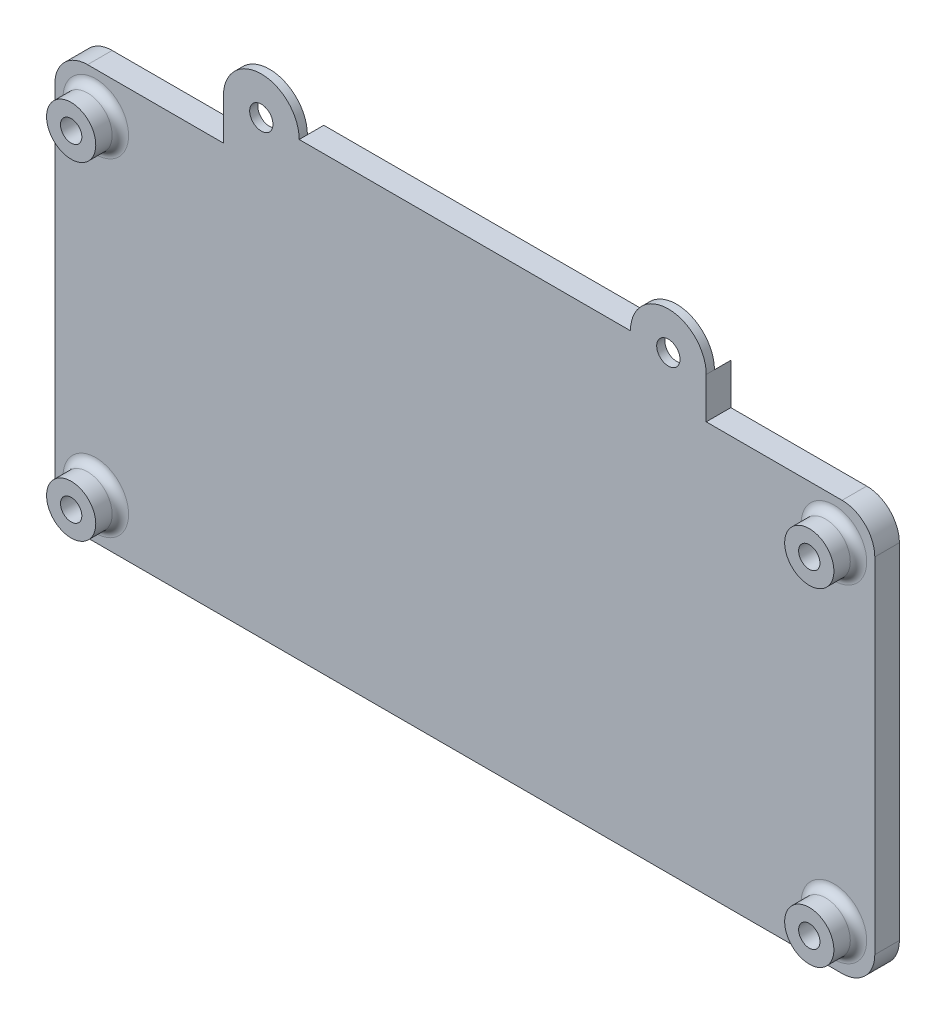
ISO-10303-21;
HEADER;
FILE_DESCRIPTION(('STEP AP214'),'2;1');
FILE_NAME('part.step','',(''),(''),'','','');
FILE_SCHEMA(('AUTOMOTIVE_DESIGN { 1 0 10303 214 1 1 1 1 }'));
ENDSEC;
DATA;
#1=APPLICATION_CONTEXT('core data for automotive mechanical design processes');
#2=APPLICATION_PROTOCOL_DEFINITION('international standard','automotive_design',2000,#1);
#3=PRODUCT_CONTEXT('',#1,'mechanical');
#4=PRODUCT('Part','Part','',(#3));
#5=PRODUCT_RELATED_PRODUCT_CATEGORY('part','',(#4));
#6=PRODUCT_DEFINITION_FORMATION('','',#4);
#7=PRODUCT_DEFINITION_CONTEXT('part definition',#1,'design');
#8=PRODUCT_DEFINITION('design','',#6,#7);
#9=PRODUCT_DEFINITION_SHAPE('','',#8);
#10=(LENGTH_UNIT() NAMED_UNIT(*) SI_UNIT(.MILLI.,.METRE.));
#11=(NAMED_UNIT(*) PLANE_ANGLE_UNIT() SI_UNIT($,.RADIAN.));
#12=(NAMED_UNIT(*) SI_UNIT($,.STERADIAN.) SOLID_ANGLE_UNIT());
#13=UNCERTAINTY_MEASURE_WITH_UNIT(LENGTH_MEASURE(1.E-05),#10,'distance_accuracy_value','');
#14=(GEOMETRIC_REPRESENTATION_CONTEXT(3) GLOBAL_UNCERTAINTY_ASSIGNED_CONTEXT((#13)) GLOBAL_UNIT_ASSIGNED_CONTEXT((#10,
#11,#12)) REPRESENTATION_CONTEXT('',''));
#15=CARTESIAN_POINT('',(0.,0.,0.));
#16=DIRECTION('',(0.,0.,1.));
#17=DIRECTION('',(1.,0.,0.));
#18=AXIS2_PLACEMENT_3D('',#15,#16,#17);
#19=CARTESIAN_POINT('',(25.1843003302005,54.987399034798,-59.6490019812324));
#20=DIRECTION('',(0.,0.,1.));
#21=DIRECTION('',(1.,0.,0.));
#22=AXIS2_PLACEMENT_3D('',#19,#20,#21);
#23=CYLINDRICAL_SURFACE('',#22,1.4224);
#24=CARTESIAN_POINT('',(25.1843003302005,54.987399034798,3.));
#25=DIRECTION('',(0.,0.,1.));
#26=DIRECTION('',(1.,0.,0.));
#27=AXIS2_PLACEMENT_3D('',#24,#25,#26);
#28=CIRCLE('',#27,1.4224);
#29=CARTESIAN_POINT('',(26.6067003302005,54.987399034798,3.));
#30=VERTEX_POINT('',#29);
#31=EDGE_CURVE('E228',#30,#30,#28,.T.);
#32=ORIENTED_EDGE('',*,*,#31,.T.);
#33=EDGE_LOOP('',(#32));
#34=FACE_BOUND('',#33,.T.);
#35=CARTESIAN_POINT('',(25.1843003302005,54.987399034798,2.));
#36=DIRECTION('',(0.,0.,-1.));
#37=DIRECTION('',(-1.,0.,0.));
#38=AXIS2_PLACEMENT_3D('',#35,#36,#37);
#39=CIRCLE('',#38,1.4224);
#40=CARTESIAN_POINT('',(23.7619003302005,54.987399034798,2.));
#41=VERTEX_POINT('',#40);
#42=EDGE_CURVE('E208',#41,#41,#39,.F.);
#43=ORIENTED_EDGE('',*,*,#42,.F.);
#44=EDGE_LOOP('',(#43));
#45=FACE_BOUND('',#44,.T.);
#46=ADVANCED_FACE('F45',(#34,#45),#23,.F.);
#47=CARTESIAN_POINT('',(74.8159003302005,54.987399034798,-59.6490019812324));
#48=DIRECTION('',(0.,0.,1.));
#49=DIRECTION('',(1.,0.,0.));
#50=AXIS2_PLACEMENT_3D('',#47,#48,#49);
#51=CYLINDRICAL_SURFACE('',#50,4.61840510398);
#52=DIRECTION('',(0.,0.,1.));
#53=VECTOR('',#52,1.);
#54=CARTESIAN_POINT('',(79.4343054346055,54.987399034798,-59.6490019812324));
#55=LINE('',#54,#53);
#56=CARTESIAN_POINT('',(79.4343054346055,54.987399034798,2.));
#57=VERTEX_POINT('',#56);
#58=CARTESIAN_POINT('',(79.4343054346055,54.987399034798,3.));
#59=VERTEX_POINT('',#58);
#60=EDGE_CURVE('E171',#57,#59,#55,.T.);
#61=ORIENTED_EDGE('',*,*,#60,.F.);
#62=CARTESIAN_POINT('',(74.8159003302005,54.987399034798,2.));
#63=DIRECTION('',(0.,0.,-1.));
#64=DIRECTION('',(-1.,0.,0.));
#65=AXIS2_PLACEMENT_3D('',#62,#63,#64);
#66=CIRCLE('',#65,4.61840510440499);
#67=CARTESIAN_POINT('',(70.1974952257955,54.987399034798,2.));
#68=VERTEX_POINT('',#67);
#69=EDGE_CURVE('E268',#68,#57,#66,.T.);
#70=ORIENTED_EDGE('',*,*,#69,.F.);
#71=DIRECTION('',(0.,0.,1.));
#72=VECTOR('',#71,1.);
#73=CARTESIAN_POINT('',(70.1974952257955,54.987399034798,-59.6490019812324));
#74=LINE('',#73,#72);
#75=CARTESIAN_POINT('',(70.1974952257955,54.987399034798,3.));
#76=VERTEX_POINT('',#75);
#77=EDGE_CURVE('E170',#68,#76,#74,.T.);
#78=ORIENTED_EDGE('',*,*,#77,.T.);
#79=CARTESIAN_POINT('',(74.8159003302005,54.987399034798,3.));
#80=DIRECTION('',(0.,0.,1.));
#81=DIRECTION('',(1.,0.,0.));
#82=AXIS2_PLACEMENT_3D('',#79,#80,#81);
#83=CIRCLE('',#82,4.61840510398);
#84=EDGE_CURVE('E216',#59,#76,#83,.T.);
#85=ORIENTED_EDGE('',*,*,#84,.F.);
#86=EDGE_LOOP('',(#61,#70,#78,#85));
#87=FACE_BOUND('',#86,.T.);
#88=ADVANCED_FACE('F457',(#87),#51,.T.);
#89=CARTESIAN_POINT('',(25.1843003302005,54.987399034798,-59.6490019812324));
#90=DIRECTION('',(0.,0.,1.));
#91=DIRECTION('',(1.,0.,0.));
#92=AXIS2_PLACEMENT_3D('',#89,#90,#91);
#93=CYLINDRICAL_SURFACE('',#92,4.61840510397999);
#94=DIRECTION('',(0.,0.,1.));
#95=VECTOR('',#94,1.);
#96=CARTESIAN_POINT('',(29.8027054346055,54.987399034798,-59.6490019812324));
#97=LINE('',#96,#95);
#98=CARTESIAN_POINT('',(29.802705434393,54.987399034798,2.));
#99=VERTEX_POINT('',#98);
#100=CARTESIAN_POINT('',(29.8027054346055,54.987399034798,3.));
#101=VERTEX_POINT('',#100);
#102=EDGE_CURVE('E240',#99,#101,#97,.T.);
#103=ORIENTED_EDGE('',*,*,#102,.F.);
#104=CARTESIAN_POINT('',(25.1843003302005,54.987399034798,2.));
#105=DIRECTION('',(0.,0.,-1.));
#106=DIRECTION('',(-1.,0.,0.));
#107=AXIS2_PLACEMENT_3D('',#104,#105,#106);
#108=CIRCLE('',#107,4.6184051041925);
#109=CARTESIAN_POINT('',(20.5660074846114,55.0195999327706,2.));
#110=VERTEX_POINT('',#109);
#111=EDGE_CURVE('E510',#110,#99,#108,.T.);
#112=ORIENTED_EDGE('',*,*,#111,.F.);
#113=DIRECTION('',(0.,0.,1.));
#114=VECTOR('',#113,1.);
#115=CARTESIAN_POINT('',(20.5660074845051,55.0195999022925,-59.6490019812324));
#116=LINE('',#115,#114);
#117=CARTESIAN_POINT('',(20.5660074845051,55.0195999022925,3.));
#118=VERTEX_POINT('',#117);
#119=EDGE_CURVE('E191',#110,#118,#116,.T.);
#120=ORIENTED_EDGE('',*,*,#119,.T.);
#121=CARTESIAN_POINT('',(25.1843003302005,54.987399034798,3.));
#122=DIRECTION('',(0.,0.,1.));
#123=DIRECTION('',(1.,0.,0.));
#124=AXIS2_PLACEMENT_3D('',#121,#122,#123);
#125=CIRCLE('',#124,4.61840510397999);
#126=EDGE_CURVE('E224',#101,#118,#125,.T.);
#127=ORIENTED_EDGE('',*,*,#126,.F.);
#128=EDGE_LOOP('',(#103,#112,#120,#127));
#129=FACE_BOUND('',#128,.T.);
#130=ADVANCED_FACE('F464',(#129),#93,.T.);
#131=CARTESIAN_POINT('',(20.3739497329237,-0.0710279611667481,-59.6490019812324));
#132=DIRECTION('',(0.999993923209248,-0.00348619342227551,0.));
#133=DIRECTION('',(0.00348619342227551,0.999993923209248,0.));
#134=AXIS2_PLACEMENT_3D('',#131,#132,#133);
#135=PLANE('',#134);
#136=DIRECTION('',(0.0034861934223459,0.999993923209247,0.));
#137=VECTOR('',#136,1.);
#138=CARTESIAN_POINT('',(20.565895226008,54.9873992176629,2.));
#139=LINE('',#138,#137);
#140=CARTESIAN_POINT('',(20.5658952256892,54.9873991262305,2.));
#141=VERTEX_POINT('',#140);
#142=EDGE_CURVE('E11',#141,#110,#139,.T.);
#143=ORIENTED_EDGE('',*,*,#142,.F.);
#144=DIRECTION('',(0.,0.,1.));
#145=VECTOR('',#144,1.);
#146=CARTESIAN_POINT('',(20.5658952253705,54.987399034798,-59.6490019812324));
#147=LINE('',#146,#145);
#148=CARTESIAN_POINT('',(20.5658952253705,54.987399034798,3.));
#149=VERTEX_POINT('',#148);
#150=EDGE_CURVE('E235',#141,#149,#147,.T.);
#151=ORIENTED_EDGE('',*,*,#150,.T.);
#152=DIRECTION('',(0.00348619342227551,0.999993923209248,0.));
#153=VECTOR('',#152,1.);
#154=CARTESIAN_POINT('',(20.3739497329237,-0.0710279611667481,3.));
#155=LINE('',#154,#153);
#156=EDGE_CURVE('E203',#149,#118,#155,.T.);
#157=ORIENTED_EDGE('',*,*,#156,.T.);
#158=ORIENTED_EDGE('',*,*,#119,.F.);
#159=EDGE_LOOP('',(#143,#151,#157,#158));
#160=FACE_BOUND('',#159,.T.);
#161=ADVANCED_FACE('F474',(#160),#135,.F.);
#162=CARTESIAN_POINT('',(74.8159003302005,54.987399034798,-59.6490019812324));
#163=DIRECTION('',(0.,0.,1.));
#164=DIRECTION('',(1.,0.,0.));
#165=AXIS2_PLACEMENT_3D('',#162,#163,#164);
#166=CYLINDRICAL_SURFACE('',#165,1.4224);
#167=CARTESIAN_POINT('',(74.8159003302005,54.987399034798,3.));
#168=DIRECTION('',(0.,0.,1.));
#169=DIRECTION('',(1.,0.,0.));
#170=AXIS2_PLACEMENT_3D('',#167,#168,#169);
#171=CIRCLE('',#170,1.4224);
#172=CARTESIAN_POINT('',(76.2383003302005,54.987399034798,3.));
#173=VERTEX_POINT('',#172);
#174=EDGE_CURVE('E232',#173,#173,#171,.T.);
#175=ORIENTED_EDGE('',*,*,#174,.T.);
#176=EDGE_LOOP('',(#175));
#177=FACE_BOUND('',#176,.T.);
#178=CARTESIAN_POINT('',(74.8159003302005,54.987399034798,2.));
#179=DIRECTION('',(0.,0.,-1.));
#180=DIRECTION('',(-1.,0.,0.));
#181=AXIS2_PLACEMENT_3D('',#178,#179,#180);
#182=CIRCLE('',#181,1.4224);
#183=CARTESIAN_POINT('',(73.3935003302005,54.987399034798,2.));
#184=VERTEX_POINT('',#183);
#185=EDGE_CURVE('E264',#184,#184,#182,.F.);
#186=ORIENTED_EDGE('',*,*,#185,.F.);
#187=EDGE_LOOP('',(#186));
#188=FACE_BOUND('',#187,.T.);
#189=ADVANCED_FACE('F470',(#177,#188),#166,.F.);
#190=CARTESIAN_POINT('',(0.,49.987399034798,3.));
#191=DIRECTION('',(0.,-1.,0.));
#192=DIRECTION('',(1.,0.,0.));
#193=AXIS2_PLACEMENT_3D('',#190,#191,#192);
#194=PLANE('',#193);
#195=DIRECTION('',(-1.,0.,0.));
#196=VECTOR('',#195,1.);
#197=CARTESIAN_POINT('',(0.,49.987399034798,3.));
#198=LINE('',#197,#196);
#199=CARTESIAN_POINT('',(20.5658952253705,49.987399034798,3.));
#200=VERTEX_POINT('',#199);
#201=CARTESIAN_POINT('',(4.00000762001499,49.987399034798,3.));
#202=VERTEX_POINT('',#201);
#203=EDGE_CURVE('E381',#200,#202,#198,.T.);
#204=ORIENTED_EDGE('',*,*,#203,.F.);
#205=DIRECTION('',(0.,0.,1.));
#206=VECTOR('',#205,1.);
#207=CARTESIAN_POINT('',(20.5658952253705,49.987399034798,-59.6490019812324));
#208=LINE('',#207,#206);
#209=CARTESIAN_POINT('',(20.5658952253705,49.987399034798,0.));
#210=VERTEX_POINT('',#209);
#211=EDGE_CURVE('E246',#210,#200,#208,.T.);
#212=ORIENTED_EDGE('',*,*,#211,.F.);
#213=DIRECTION('',(-1.,0.,0.));
#214=VECTOR('',#213,1.);
#215=CARTESIAN_POINT('',(0.,49.987399034798,0.));
#216=LINE('',#215,#214);
#217=CARTESIAN_POINT('',(4.00000762001499,49.987399034798,0.));
#218=VERTEX_POINT('',#217);
#219=EDGE_CURVE('E349',#210,#218,#216,.T.);
#220=ORIENTED_EDGE('',*,*,#219,.T.);
#221=DIRECTION('',(0.,0.,-1.));
#222=VECTOR('',#221,1.);
#223=CARTESIAN_POINT('',(4.00000762001499,49.987399034798,3.));
#224=LINE('',#223,#222);
#225=EDGE_CURVE('E309',#202,#218,#224,.T.);
#226=ORIENTED_EDGE('',*,*,#225,.F.);
#227=EDGE_LOOP('',(#204,#212,#220,#226));
#228=FACE_BOUND('',#227,.T.);
#229=ADVANCED_FACE('F491',(#228),#194,.F.);
#230=CARTESIAN_POINT('',(96.000193040386,4.00000762001503,3.));
#231=DIRECTION('',(0.,0.,-1.));
#232=DIRECTION('',(-1.,0.,0.));
#233=AXIS2_PLACEMENT_3D('',#230,#231,#232);
#234=CYLINDRICAL_SURFACE('',#233,3.98730759461498);
#235=CARTESIAN_POINT('',(96.000193040386,4.00000762001503,0.));
#236=DIRECTION('',(0.,0.,1.));
#237=DIRECTION('',(1.,0.,0.));
#238=AXIS2_PLACEMENT_3D('',#235,#236,#237);
#239=CIRCLE('',#238,3.98730759461498);
#240=CARTESIAN_POINT('',(99.987500635001,4.000007620015,0.));
#241=VERTEX_POINT('',#240);
#242=CARTESIAN_POINT('',(96.000193040386,0.01270002540005,0.));
#243=VERTEX_POINT('',#242);
#244=EDGE_CURVE('E358',#241,#243,#239,.F.);
#245=ORIENTED_EDGE('',*,*,#244,.F.);
#246=DIRECTION('',(0.,0.,-1.));
#247=VECTOR('',#246,1.);
#248=CARTESIAN_POINT('',(99.987500635001,4.000007620015,3.));
#249=LINE('',#248,#247);
#250=CARTESIAN_POINT('',(99.987500635001,4.000007620015,3.));
#251=VERTEX_POINT('',#250);
#252=EDGE_CURVE('E300',#251,#241,#249,.T.);
#253=ORIENTED_EDGE('',*,*,#252,.F.);
#254=CARTESIAN_POINT('',(96.000193040386,4.00000762001503,3.));
#255=DIRECTION('',(0.,0.,1.));
#256=DIRECTION('',(1.,0.,0.));
#257=AXIS2_PLACEMENT_3D('',#254,#255,#256);
#258=CIRCLE('',#257,3.98730759461498);
#259=CARTESIAN_POINT('',(96.000193040386,0.01270002540005,3.));
#260=VERTEX_POINT('',#259);
#261=EDGE_CURVE('E333',#251,#260,#258,.F.);
#262=ORIENTED_EDGE('',*,*,#261,.T.);
#263=DIRECTION('',(0.,0.,-1.));
#264=VECTOR('',#263,1.);
#265=CARTESIAN_POINT('',(96.000193040386,0.01270002540005,3.));
#266=LINE('',#265,#264);
#267=EDGE_CURVE('E325',#260,#243,#266,.T.);
#268=ORIENTED_EDGE('',*,*,#267,.T.);
#269=EDGE_LOOP('',(#245,#253,#262,#268));
#270=FACE_BOUND('',#269,.T.);
#271=ADVANCED_FACE('F569',(#270),#234,.T.);
#272=CARTESIAN_POINT('',(99.987500635001,0.,3.));
#273=DIRECTION('',(-1.,0.,0.));
#274=DIRECTION('',(0.,0.,1.));
#275=AXIS2_PLACEMENT_3D('',#272,#273,#274);
#276=PLANE('',#275);
#277=DIRECTION('',(0.,1.,0.));
#278=VECTOR('',#277,1.);
#279=CARTESIAN_POINT('',(99.987500635001,0.,0.));
#280=LINE('',#279,#278);
#281=CARTESIAN_POINT('',(99.987500635001,46.000091440183,0.));
#282=VERTEX_POINT('',#281);
#283=EDGE_CURVE('E354',#241,#282,#280,.T.);
#284=ORIENTED_EDGE('',*,*,#283,.T.);
#285=DIRECTION('',(0.,0.,-1.));
#286=VECTOR('',#285,1.);
#287=CARTESIAN_POINT('',(99.987500635001,46.000091440183,3.));
#288=LINE('',#287,#286);
#289=CARTESIAN_POINT('',(99.987500635001,46.000091440183,3.));
#290=VERTEX_POINT('',#289);
#291=EDGE_CURVE('E303',#290,#282,#288,.T.);
#292=ORIENTED_EDGE('',*,*,#291,.F.);
#293=DIRECTION('',(0.,1.,0.));
#294=VECTOR('',#293,1.);
#295=CARTESIAN_POINT('',(99.987500635001,0.,3.));
#296=LINE('',#295,#294);
#297=EDGE_CURVE('E386',#251,#290,#296,.T.);
#298=ORIENTED_EDGE('',*,*,#297,.F.);
#299=ORIENTED_EDGE('',*,*,#252,.T.);
#300=EDGE_LOOP('',(#284,#292,#298,#299));
#301=FACE_BOUND('',#300,.T.);
#302=ADVANCED_FACE('F572',(#301),#276,.F.);
#303=CARTESIAN_POINT('',(96.000193040386,46.000091440183,3.));
#304=DIRECTION('',(0.,0.,-1.));
#305=DIRECTION('',(-1.,0.,0.));
#306=AXIS2_PLACEMENT_3D('',#303,#304,#305);
#307=CYLINDRICAL_SURFACE('',#306,3.987307594615);
#308=CARTESIAN_POINT('',(96.000193040386,46.000091440183,0.));
#309=DIRECTION('',(0.,0.,1.));
#310=DIRECTION('',(1.,0.,0.));
#311=AXIS2_PLACEMENT_3D('',#308,#309,#310);
#312=CIRCLE('',#311,3.987307594615);
#313=CARTESIAN_POINT('',(96.000193040386,49.987399034798,0.));
#314=VERTEX_POINT('',#313);
#315=EDGE_CURVE('E350',#314,#282,#312,.F.);
#316=ORIENTED_EDGE('',*,*,#315,.F.);
#317=DIRECTION('',(0.,0.,-1.));
#318=VECTOR('',#317,1.);
#319=CARTESIAN_POINT('',(96.000193040386,49.987399034798,3.));
#320=LINE('',#319,#318);
#321=CARTESIAN_POINT('',(96.000193040386,49.987399034798,3.));
#322=VERTEX_POINT('',#321);
#323=EDGE_CURVE('E306',#322,#314,#320,.T.);
#324=ORIENTED_EDGE('',*,*,#323,.F.);
#325=CARTESIAN_POINT('',(96.000193040386,46.000091440183,3.));
#326=DIRECTION('',(0.,0.,1.));
#327=DIRECTION('',(1.,0.,0.));
#328=AXIS2_PLACEMENT_3D('',#325,#326,#327);
#329=CIRCLE('',#328,3.987307594615);
#330=EDGE_CURVE('E382',#322,#290,#329,.F.);
#331=ORIENTED_EDGE('',*,*,#330,.T.);
#332=ORIENTED_EDGE('',*,*,#291,.T.);
#333=EDGE_LOOP('',(#316,#324,#331,#332));
#334=FACE_BOUND('',#333,.T.);
#335=ADVANCED_FACE('F575',(#334),#307,.T.);
#336=CARTESIAN_POINT('',(79.4343054350305,49.987399034798,0.));
#337=VERTEX_POINT('',#336);
#338=EDGE_CURVE('E346',#314,#337,#216,.T.);
#339=ORIENTED_EDGE('',*,*,#338,.T.);
#340=DIRECTION('',(0.,0.,1.));
#341=VECTOR('',#340,1.);
#342=CARTESIAN_POINT('',(79.4343054350305,49.987399034798,-59.6490019812324));
#343=LINE('',#342,#341);
#344=CARTESIAN_POINT('',(79.4343054350305,49.987399034798,3.));
#345=VERTEX_POINT('',#344);
#346=EDGE_CURVE('E189',#337,#345,#343,.T.);
#347=ORIENTED_EDGE('',*,*,#346,.T.);
#348=EDGE_CURVE('E377',#322,#345,#198,.T.);
#349=ORIENTED_EDGE('',*,*,#348,.F.);
#350=ORIENTED_EDGE('',*,*,#323,.T.);
#351=EDGE_LOOP('',(#339,#347,#349,#350));
#352=FACE_BOUND('',#351,.T.);
#353=ADVANCED_FACE('F578',(#352),#194,.F.);
#354=CARTESIAN_POINT('',(4.00000762001498,46.000091440183,3.));
#355=DIRECTION('',(0.,0.,-1.));
#356=DIRECTION('',(-1.,0.,0.));
#357=AXIS2_PLACEMENT_3D('',#354,#355,#356);
#358=CYLINDRICAL_SURFACE('',#357,3.98730759461493);
#359=CARTESIAN_POINT('',(4.00000762001498,46.000091440183,0.));
#360=DIRECTION('',(0.,0.,1.));
#361=DIRECTION('',(1.,0.,0.));
#362=AXIS2_PLACEMENT_3D('',#359,#360,#361);
#363=CIRCLE('',#362,3.98730759461493);
#364=CARTESIAN_POINT('',(0.01270002540005,46.000091440183,0.));
#365=VERTEX_POINT('',#364);
#366=EDGE_CURVE('E342',#218,#365,#363,.T.);
#367=ORIENTED_EDGE('',*,*,#366,.T.);
#368=DIRECTION('',(0.,0.,-1.));
#369=VECTOR('',#368,1.);
#370=CARTESIAN_POINT('',(0.01270002540005,46.000091440183,3.));
#371=LINE('',#370,#369);
#372=CARTESIAN_POINT('',(0.01270002540005,46.000091440183,3.));
#373=VERTEX_POINT('',#372);
#374=EDGE_CURVE('E313',#373,#365,#371,.T.);
#375=ORIENTED_EDGE('',*,*,#374,.F.);
#376=CARTESIAN_POINT('',(4.00000762001498,46.000091440183,3.));
#377=DIRECTION('',(0.,0.,1.));
#378=DIRECTION('',(1.,0.,0.));
#379=AXIS2_PLACEMENT_3D('',#376,#377,#378);
#380=CIRCLE('',#379,3.98730759461493);
#381=EDGE_CURVE('E373',#202,#373,#380,.T.);
#382=ORIENTED_EDGE('',*,*,#381,.F.);
#383=ORIENTED_EDGE('',*,*,#225,.T.);
#384=EDGE_LOOP('',(#367,#375,#382,#383));
#385=FACE_BOUND('',#384,.T.);
#386=ADVANCED_FACE('F553',(#385),#358,.T.);
#387=CARTESIAN_POINT('',(0.0127000254000502,0.,3.));
#388=DIRECTION('',(1.,0.,0.));
#389=DIRECTION('',(0.,1.,0.));
#390=AXIS2_PLACEMENT_3D('',#387,#388,#389);
#391=PLANE('',#390);
#392=DIRECTION('',(0.,-1.,0.));
#393=VECTOR('',#392,1.);
#394=CARTESIAN_POINT('',(0.0127000254000502,0.,0.));
#395=LINE('',#394,#393);
#396=CARTESIAN_POINT('',(0.0127000254000502,4.00000762001497,0.));
#397=VERTEX_POINT('',#396);
#398=EDGE_CURVE('E338',#365,#397,#395,.T.);
#399=ORIENTED_EDGE('',*,*,#398,.T.);
#400=DIRECTION('',(0.,0.,-1.));
#401=VECTOR('',#400,1.);
#402=CARTESIAN_POINT('',(0.0127000254000502,4.00000762001497,3.));
#403=LINE('',#402,#401);
#404=CARTESIAN_POINT('',(0.0127000254000502,4.00000762001497,3.));
#405=VERTEX_POINT('',#404);
#406=EDGE_CURVE('E317',#405,#397,#403,.T.);
#407=ORIENTED_EDGE('',*,*,#406,.F.);
#408=DIRECTION('',(0.,-1.,0.));
#409=VECTOR('',#408,1.);
#410=CARTESIAN_POINT('',(0.0127000254000502,0.,3.));
#411=LINE('',#410,#409);
#412=EDGE_CURVE('E369',#373,#405,#411,.T.);
#413=ORIENTED_EDGE('',*,*,#412,.F.);
#414=ORIENTED_EDGE('',*,*,#374,.T.);
#415=EDGE_LOOP('',(#399,#407,#413,#414));
#416=FACE_BOUND('',#415,.T.);
#417=ADVANCED_FACE('F558',(#416),#391,.F.);
#418=CARTESIAN_POINT('',(4.00000762001501,4.00000762001501,3.));
#419=DIRECTION('',(0.,0.,-1.));
#420=DIRECTION('',(-1.,0.,0.));
#421=AXIS2_PLACEMENT_3D('',#418,#419,#420);
#422=CYLINDRICAL_SURFACE('',#421,3.98730759461496);
#423=CARTESIAN_POINT('',(4.00000762001501,4.00000762001501,0.));
#424=DIRECTION('',(0.,0.,1.));
#425=DIRECTION('',(1.,0.,0.));
#426=AXIS2_PLACEMENT_3D('',#423,#424,#425);
#427=CIRCLE('',#426,3.98730759461496);
#428=CARTESIAN_POINT('',(4.000007620015,0.01270002540005,0.));
#429=VERTEX_POINT('',#428);
#430=EDGE_CURVE('E334',#397,#429,#427,.T.);
#431=ORIENTED_EDGE('',*,*,#430,.T.);
#432=DIRECTION('',(0.,0.,-1.));
#433=VECTOR('',#432,1.);
#434=CARTESIAN_POINT('',(4.000007620015,0.01270002540005,3.));
#435=LINE('',#434,#433);
#436=CARTESIAN_POINT('',(4.000007620015,0.01270002540005,3.));
#437=VERTEX_POINT('',#436);
#438=EDGE_CURVE('E321',#437,#429,#435,.T.);
#439=ORIENTED_EDGE('',*,*,#438,.F.);
#440=CARTESIAN_POINT('',(4.00000762001501,4.00000762001501,3.));
#441=DIRECTION('',(0.,0.,1.));
#442=DIRECTION('',(1.,0.,0.));
#443=AXIS2_PLACEMENT_3D('',#440,#441,#442);
#444=CIRCLE('',#443,3.98730759461496);
#445=EDGE_CURVE('E365',#405,#437,#444,.T.);
#446=ORIENTED_EDGE('',*,*,#445,.F.);
#447=ORIENTED_EDGE('',*,*,#406,.T.);
#448=EDGE_LOOP('',(#431,#439,#446,#447));
#449=FACE_BOUND('',#448,.T.);
#450=ADVANCED_FACE('F560',(#449),#422,.T.);
#451=CARTESIAN_POINT('',(0.,0.01270002540005,3.));
#452=DIRECTION('',(0.,1.,0.));
#453=DIRECTION('',(0.,0.,1.));
#454=AXIS2_PLACEMENT_3D('',#451,#452,#453);
#455=PLANE('',#454);
#456=DIRECTION('',(1.,0.,0.));
#457=VECTOR('',#456,1.);
#458=CARTESIAN_POINT('',(0.,0.01270002540005,0.));
#459=LINE('',#458,#457);
#460=EDGE_CURVE('E329',#429,#243,#459,.T.);
#461=ORIENTED_EDGE('',*,*,#460,.T.);
#462=ORIENTED_EDGE('',*,*,#267,.F.);
#463=DIRECTION('',(1.,0.,0.));
#464=VECTOR('',#463,1.);
#465=CARTESIAN_POINT('',(0.,0.01270002540005,3.));
#466=LINE('',#465,#464);
#467=EDGE_CURVE('E328',#437,#260,#466,.T.);
#468=ORIENTED_EDGE('',*,*,#467,.F.);
#469=ORIENTED_EDGE('',*,*,#438,.T.);
#470=EDGE_LOOP('',(#461,#462,#468,#469));
#471=FACE_BOUND('',#470,.T.);
#472=ADVANCED_FACE('F562',(#471),#455,.F.);
#473=CARTESIAN_POINT('',(0.,0.,3.));
#474=DIRECTION('',(0.,0.,1.));
#475=DIRECTION('',(1.,0.,0.));
#476=AXIS2_PLACEMENT_3D('',#473,#474,#475);
#477=PLANE('',#476);
#478=CARTESIAN_POINT('',(95.000190500381,5.00001016002,3.));
#479=DIRECTION('',(0.,0.,1.));
#480=DIRECTION('',(1.,0.,0.));
#481=AXIS2_PLACEMENT_3D('',#478,#479,#480);
#482=CIRCLE('',#481,4.00000000000001);
#483=CARTESIAN_POINT('',(99.000190500381,5.00001016002,3.));
#484=VERTEX_POINT('',#483);
#485=EDGE_CURVE('E280',#484,#484,#482,.F.);
#486=ORIENTED_EDGE('',*,*,#485,.T.);
#487=EDGE_LOOP('',(#486));
#488=FACE_BOUND('',#487,.T.);
#489=CARTESIAN_POINT('',(95.000190500381,45.000088900178,3.));
#490=DIRECTION('',(0.,0.,1.));
#491=DIRECTION('',(1.,0.,0.));
#492=AXIS2_PLACEMENT_3D('',#489,#490,#491);
#493=CIRCLE('',#492,4.00000000000001);
#494=CARTESIAN_POINT('',(99.000190500381,45.000088900178,3.));
#495=VERTEX_POINT('',#494);
#496=EDGE_CURVE('E284',#495,#495,#493,.F.);
#497=ORIENTED_EDGE('',*,*,#496,.T.);
#498=EDGE_LOOP('',(#497));
#499=FACE_BOUND('',#498,.T.);
#500=CARTESIAN_POINT('',(5.00001016002,45.000088900178,3.));
#501=DIRECTION('',(0.,0.,1.));
#502=DIRECTION('',(1.,0.,0.));
#503=AXIS2_PLACEMENT_3D('',#500,#501,#502);
#504=CIRCLE('',#503,4.);
#505=CARTESIAN_POINT('',(9.00001016002,45.000088900178,3.));
#506=VERTEX_POINT('',#505);
#507=EDGE_CURVE('E288',#506,#506,#504,.F.);
#508=ORIENTED_EDGE('',*,*,#507,.T.);
#509=EDGE_LOOP('',(#508));
#510=FACE_BOUND('',#509,.T.);
#511=CARTESIAN_POINT('',(5.00001016002,5.00001016002,3.));
#512=DIRECTION('',(0.,0.,1.));
#513=DIRECTION('',(1.,0.,0.));
#514=AXIS2_PLACEMENT_3D('',#511,#512,#513);
#515=CIRCLE('',#514,4.);
#516=CARTESIAN_POINT('',(9.00001016002,5.00001016002,3.));
#517=VERTEX_POINT('',#516);
#518=EDGE_CURVE('E292',#517,#517,#515,.F.);
#519=ORIENTED_EDGE('',*,*,#518,.T.);
#520=EDGE_LOOP('',(#519));
#521=FACE_BOUND('',#520,.T.);
#522=ORIENTED_EDGE('',*,*,#261,.F.);
#523=ORIENTED_EDGE('',*,*,#297,.T.);
#524=ORIENTED_EDGE('',*,*,#330,.F.);
#525=ORIENTED_EDGE('',*,*,#348,.T.);
#526=DIRECTION('',(0.,1.,0.));
#527=VECTOR('',#526,1.);
#528=CARTESIAN_POINT('',(79.4343054350305,0.,3.));
#529=LINE('',#528,#527);
#530=EDGE_CURVE('E212',#345,#59,#529,.T.);
#531=ORIENTED_EDGE('',*,*,#530,.T.);
#532=ORIENTED_EDGE('',*,*,#84,.T.);
#533=DIRECTION('',(1.,0.,0.));
#534=VECTOR('',#533,1.);
#535=CARTESIAN_POINT('',(0.,54.987399034798,3.));
#536=LINE('',#535,#534);
#537=EDGE_CURVE('E220',#101,#76,#536,.T.);
#538=ORIENTED_EDGE('',*,*,#537,.F.);
#539=ORIENTED_EDGE('',*,*,#126,.T.);
#540=ORIENTED_EDGE('',*,*,#156,.F.);
#541=DIRECTION('',(0.,-1.,0.));
#542=VECTOR('',#541,1.);
#543=CARTESIAN_POINT('',(20.5658952253707,0.,3.));
#544=LINE('',#543,#542);
#545=EDGE_CURVE('E207',#149,#200,#544,.T.);
#546=ORIENTED_EDGE('',*,*,#545,.T.);
#547=ORIENTED_EDGE('',*,*,#203,.T.);
#548=ORIENTED_EDGE('',*,*,#381,.T.);
#549=ORIENTED_EDGE('',*,*,#412,.T.);
#550=ORIENTED_EDGE('',*,*,#445,.T.);
#551=ORIENTED_EDGE('',*,*,#467,.T.);
#552=EDGE_LOOP('',(#522,#523,#524,#525,#531,#532,#538,#539,#540,#546,#547,#548,#549,#550,#551));
#553=FACE_BOUND('',#552,.T.);
#554=ORIENTED_EDGE('',*,*,#31,.F.);
#555=EDGE_LOOP('',(#554));
#556=FACE_BOUND('',#555,.T.);
#557=ORIENTED_EDGE('',*,*,#174,.F.);
#558=EDGE_LOOP('',(#557));
#559=FACE_BOUND('',#558,.T.);
#560=ADVANCED_FACE('F504',(#488,#499,#510,#521,#553,#556,#559),#477,.T.);
#561=CARTESIAN_POINT('',(0.,0.,0.));
#562=DIRECTION('',(0.,0.,1.));
#563=DIRECTION('',(1.,0.,0.));
#564=AXIS2_PLACEMENT_3D('',#561,#562,#563);
#565=PLANE('',#564);
#566=DIRECTION('',(-1.,0.,0.));
#567=VECTOR('',#566,1.);
#568=CARTESIAN_POINT('',(0.,54.987399034798,0.));
#569=LINE('',#568,#567);
#570=CARTESIAN_POINT('',(70.1974952262205,54.987399034798,0.));
#571=VERTEX_POINT('',#570);
#572=CARTESIAN_POINT('',(29.802705434393,54.987399034798,0.));
#573=VERTEX_POINT('',#572);
#574=EDGE_CURVE('E182',#571,#573,#569,.T.);
#575=ORIENTED_EDGE('',*,*,#574,.F.);
#576=CARTESIAN_POINT('',(74.8159003302005,54.987399034798,0.));
#577=DIRECTION('',(0.,0.,-1.));
#578=DIRECTION('',(-1.,0.,0.));
#579=AXIS2_PLACEMENT_3D('',#576,#577,#578);
#580=CIRCLE('',#579,4.61840510440499);
#581=CARTESIAN_POINT('',(79.4343054346055,54.987399034798,0.));
#582=VERTEX_POINT('',#581);
#583=EDGE_CURVE('E162',#582,#571,#580,.T.);
#584=ORIENTED_EDGE('',*,*,#583,.F.);
#585=DIRECTION('',(0.,-1.,0.));
#586=VECTOR('',#585,1.);
#587=CARTESIAN_POINT('',(79.4343054350305,0.,0.));
#588=LINE('',#587,#586);
#589=EDGE_CURVE('E178',#582,#337,#588,.T.);
#590=ORIENTED_EDGE('',*,*,#589,.T.);
#591=ORIENTED_EDGE('',*,*,#338,.F.);
#592=ORIENTED_EDGE('',*,*,#315,.T.);
#593=ORIENTED_EDGE('',*,*,#283,.F.);
#594=ORIENTED_EDGE('',*,*,#244,.T.);
#595=ORIENTED_EDGE('',*,*,#460,.F.);
#596=ORIENTED_EDGE('',*,*,#430,.F.);
#597=ORIENTED_EDGE('',*,*,#398,.F.);
#598=ORIENTED_EDGE('',*,*,#366,.F.);
#599=ORIENTED_EDGE('',*,*,#219,.F.);
#600=DIRECTION('',(0.,1.,0.));
#601=VECTOR('',#600,1.);
#602=CARTESIAN_POINT('',(20.5658952253707,0.,0.));
#603=LINE('',#602,#601);
#604=CARTESIAN_POINT('',(20.565895226008,54.9873992176629,0.));
#605=VERTEX_POINT('',#604);
#606=EDGE_CURVE('E195',#210,#605,#603,.T.);
#607=ORIENTED_EDGE('',*,*,#606,.T.);
#608=CARTESIAN_POINT('',(25.1843003302005,54.987399034798,0.));
#609=DIRECTION('',(0.,0.,-1.));
#610=DIRECTION('',(-1.,0.,0.));
#611=AXIS2_PLACEMENT_3D('',#608,#609,#610);
#612=CIRCLE('',#611,4.6184051041925);
#613=EDGE_CURVE('E185',#573,#605,#612,.T.);
#614=ORIENTED_EDGE('',*,*,#613,.F.);
#615=EDGE_LOOP('',(#575,#584,#590,#591,#592,#593,#594,#595,#596,#597,#598,#599,#607,#614));
#616=FACE_BOUND('',#615,.T.);
#617=CARTESIAN_POINT('',(5.00001016002,45.000088900178,0.));
#618=DIRECTION('',(0.,0.,1.));
#619=DIRECTION('',(1.,0.,0.));
#620=AXIS2_PLACEMENT_3D('',#617,#618,#619);
#621=CIRCLE('',#620,1.3);
#622=CARTESIAN_POINT('',(6.30001016002,45.000088900178,0.));
#623=VERTEX_POINT('',#622);
#624=EDGE_CURVE('E392',#623,#623,#621,.T.);
#625=ORIENTED_EDGE('',*,*,#624,.T.);
#626=EDGE_LOOP('',(#625));
#627=FACE_BOUND('',#626,.T.);
#628=CARTESIAN_POINT('',(95.000190500381,45.000088900178,0.));
#629=DIRECTION('',(0.,0.,1.));
#630=DIRECTION('',(1.,0.,0.));
#631=AXIS2_PLACEMENT_3D('',#628,#629,#630);
#632=CIRCLE('',#631,1.29999999999999);
#633=CARTESIAN_POINT('',(96.300190500381,45.000088900178,0.));
#634=VERTEX_POINT('',#633);
#635=EDGE_CURVE('E404',#634,#634,#632,.T.);
#636=ORIENTED_EDGE('',*,*,#635,.T.);
#637=EDGE_LOOP('',(#636));
#638=FACE_BOUND('',#637,.T.);
#639=CARTESIAN_POINT('',(95.000190500381,5.00001016002,0.));
#640=DIRECTION('',(0.,0.,1.));
#641=DIRECTION('',(1.,0.,0.));
#642=AXIS2_PLACEMENT_3D('',#639,#640,#641);
#643=CIRCLE('',#642,1.29999999999999);
#644=CARTESIAN_POINT('',(96.300190500381,5.00001016002,0.));
#645=VERTEX_POINT('',#644);
#646=EDGE_CURVE('E416',#645,#645,#643,.T.);
#647=ORIENTED_EDGE('',*,*,#646,.T.);
#648=EDGE_LOOP('',(#647));
#649=FACE_BOUND('',#648,.T.);
#650=CARTESIAN_POINT('',(5.00001016002,5.00001016002,0.));
#651=DIRECTION('',(0.,0.,1.));
#652=DIRECTION('',(1.,0.,0.));
#653=AXIS2_PLACEMENT_3D('',#650,#651,#652);
#654=CIRCLE('',#653,1.3);
#655=CARTESIAN_POINT('',(6.30001016002,5.00001016002,0.));
#656=VERTEX_POINT('',#655);
#657=EDGE_CURVE('E263',#656,#656,#654,.T.);
#658=ORIENTED_EDGE('',*,*,#657,.T.);
#659=EDGE_LOOP('',(#658));
#660=FACE_BOUND('',#659,.T.);
#661=ADVANCED_FACE('F175',(#616,#627,#638,#649,#660),#565,.F.);
#662=CARTESIAN_POINT('',(5.00001016002,45.000088900178,6.));
#663=DIRECTION('',(0.,0.,-1.));
#664=DIRECTION('',(-1.,0.,0.));
#665=AXIS2_PLACEMENT_3D('',#662,#663,#664);
#666=CYLINDRICAL_SURFACE('',#665,1.3);
#667=CARTESIAN_POINT('',(5.00001016002,45.000088900178,6.));
#668=DIRECTION('',(0.,0.,1.));
#669=DIRECTION('',(1.,0.,0.));
#670=AXIS2_PLACEMENT_3D('',#667,#668,#669);
#671=CIRCLE('',#670,1.3);
#672=CARTESIAN_POINT('',(6.30001016002,45.000088900178,6.));
#673=VERTEX_POINT('',#672);
#674=EDGE_CURVE('E396',#673,#673,#671,.T.);
#675=ORIENTED_EDGE('',*,*,#674,.T.);
#676=EDGE_LOOP('',(#675));
#677=FACE_BOUND('',#676,.T.);
#678=ORIENTED_EDGE('',*,*,#624,.F.);
#679=EDGE_LOOP('',(#678));
#680=FACE_BOUND('',#679,.T.);
#681=ADVANCED_FACE('F616',(#677,#680),#666,.F.);
#682=CARTESIAN_POINT('',(5.00001016002,45.000088900178,6.));
#683=DIRECTION('',(0.,0.,-1.));
#684=DIRECTION('',(-1.,0.,0.));
#685=AXIS2_PLACEMENT_3D('',#682,#683,#684);
#686=CYLINDRICAL_SURFACE('',#685,3.);
#687=CARTESIAN_POINT('',(5.00001016002,45.000088900178,4.));
#688=DIRECTION('',(0.,0.,1.));
#689=DIRECTION('',(1.,0.,0.));
#690=AXIS2_PLACEMENT_3D('',#687,#688,#689);
#691=CIRCLE('',#690,3.);
#692=CARTESIAN_POINT('',(8.00001016002,45.000088900178,4.));
#693=VERTEX_POINT('',#692);
#694=EDGE_CURVE('E272',#693,#693,#691,.T.);
#695=ORIENTED_EDGE('',*,*,#694,.T.);
#696=EDGE_LOOP('',(#695));
#697=FACE_BOUND('',#696,.T.);
#698=CARTESIAN_POINT('',(5.00001016002,45.000088900178,6.));
#699=DIRECTION('',(0.,0.,1.));
#700=DIRECTION('',(1.,0.,0.));
#701=AXIS2_PLACEMENT_3D('',#698,#699,#700);
#702=CIRCLE('',#701,3.);
#703=CARTESIAN_POINT('',(8.00001016002,45.000088900178,6.));
#704=VERTEX_POINT('',#703);
#705=EDGE_CURVE('E362',#704,#704,#702,.T.);
#706=ORIENTED_EDGE('',*,*,#705,.F.);
#707=EDGE_LOOP('',(#706));
#708=FACE_BOUND('',#707,.T.);
#709=ADVANCED_FACE('F612',(#697,#708),#686,.T.);
#710=CARTESIAN_POINT('',(0.,0.,6.));
#711=DIRECTION('',(0.,0.,1.));
#712=DIRECTION('',(1.,0.,0.));
#713=AXIS2_PLACEMENT_3D('',#710,#711,#712);
#714=PLANE('',#713);
#715=ORIENTED_EDGE('',*,*,#674,.F.);
#716=EDGE_LOOP('',(#715));
#717=FACE_BOUND('',#716,.T.);
#718=ORIENTED_EDGE('',*,*,#705,.T.);
#719=EDGE_LOOP('',(#718));
#720=FACE_BOUND('',#719,.T.);
#721=ADVANCED_FACE('F615',(#717,#720),#714,.T.);
#722=CARTESIAN_POINT('',(95.000190500381,45.000088900178,6.));
#723=DIRECTION('',(0.,0.,-1.));
#724=DIRECTION('',(-1.,0.,0.));
#725=AXIS2_PLACEMENT_3D('',#722,#723,#724);
#726=CYLINDRICAL_SURFACE('',#725,1.29999999999999);
#727=CARTESIAN_POINT('',(95.000190500381,45.000088900178,6.));
#728=DIRECTION('',(0.,0.,1.));
#729=DIRECTION('',(1.,0.,0.));
#730=AXIS2_PLACEMENT_3D('',#727,#728,#729);
#731=CIRCLE('',#730,1.29999999999999);
#732=CARTESIAN_POINT('',(96.300190500381,45.000088900178,6.));
#733=VERTEX_POINT('',#732);
#734=EDGE_CURVE('E408',#733,#733,#731,.T.);
#735=ORIENTED_EDGE('',*,*,#734,.T.);
#736=EDGE_LOOP('',(#735));
#737=FACE_BOUND('',#736,.T.);
#738=ORIENTED_EDGE('',*,*,#635,.F.);
#739=EDGE_LOOP('',(#738));
#740=FACE_BOUND('',#739,.T.);
#741=ADVANCED_FACE('F621',(#737,#740),#726,.F.);
#742=CARTESIAN_POINT('',(95.000190500381,45.000088900178,6.));
#743=DIRECTION('',(0.,0.,-1.));
#744=DIRECTION('',(-1.,0.,0.));
#745=AXIS2_PLACEMENT_3D('',#742,#743,#744);
#746=CYLINDRICAL_SURFACE('',#745,3.00000000000001);
#747=CARTESIAN_POINT('',(95.000190500381,45.000088900178,4.));
#748=DIRECTION('',(0.,0.,1.));
#749=DIRECTION('',(1.,0.,0.));
#750=AXIS2_PLACEMENT_3D('',#747,#748,#749);
#751=CIRCLE('',#750,3.00000000000001);
#752=CARTESIAN_POINT('',(98.000190500381,45.000088900178,4.));
#753=VERTEX_POINT('',#752);
#754=EDGE_CURVE('E276',#753,#753,#751,.T.);
#755=ORIENTED_EDGE('',*,*,#754,.T.);
#756=EDGE_LOOP('',(#755));
#757=FACE_BOUND('',#756,.T.);
#758=CARTESIAN_POINT('',(95.000190500381,45.000088900178,6.));
#759=DIRECTION('',(0.,0.,1.));
#760=DIRECTION('',(1.,0.,0.));
#761=AXIS2_PLACEMENT_3D('',#758,#759,#760);
#762=CIRCLE('',#761,3.00000000000001);
#763=CARTESIAN_POINT('',(98.000190500381,45.000088900178,6.));
#764=VERTEX_POINT('',#763);
#765=EDGE_CURVE('E397',#764,#764,#762,.T.);
#766=ORIENTED_EDGE('',*,*,#765,.F.);
#767=EDGE_LOOP('',(#766));
#768=FACE_BOUND('',#767,.T.);
#769=ADVANCED_FACE('F627',(#757,#768),#746,.T.);
#770=CARTESIAN_POINT('',(0.,0.,6.));
#771=DIRECTION('',(0.,0.,1.));
#772=DIRECTION('',(1.,0.,0.));
#773=AXIS2_PLACEMENT_3D('',#770,#771,#772);
#774=PLANE('',#773);
#775=ORIENTED_EDGE('',*,*,#734,.F.);
#776=EDGE_LOOP('',(#775));
#777=FACE_BOUND('',#776,.T.);
#778=ORIENTED_EDGE('',*,*,#765,.T.);
#779=EDGE_LOOP('',(#778));
#780=FACE_BOUND('',#779,.T.);
#781=ADVANCED_FACE('F680',(#777,#780),#774,.T.);
#782=CARTESIAN_POINT('',(95.000190500381,5.00001016002,6.));
#783=DIRECTION('',(0.,0.,-1.));
#784=DIRECTION('',(-1.,0.,0.));
#785=AXIS2_PLACEMENT_3D('',#782,#783,#784);
#786=CYLINDRICAL_SURFACE('',#785,1.29999999999999);
#787=CARTESIAN_POINT('',(95.000190500381,5.00001016002,6.));
#788=DIRECTION('',(0.,0.,1.));
#789=DIRECTION('',(1.,0.,0.));
#790=AXIS2_PLACEMENT_3D('',#787,#788,#789);
#791=CIRCLE('',#790,1.29999999999999);
#792=CARTESIAN_POINT('',(96.300190500381,5.00001016002,6.));
#793=VERTEX_POINT('',#792);
#794=EDGE_CURVE('E420',#793,#793,#791,.T.);
#795=ORIENTED_EDGE('',*,*,#794,.T.);
#796=EDGE_LOOP('',(#795));
#797=FACE_BOUND('',#796,.T.);
#798=ORIENTED_EDGE('',*,*,#646,.F.);
#799=EDGE_LOOP('',(#798));
#800=FACE_BOUND('',#799,.T.);
#801=ADVANCED_FACE('F695',(#797,#800),#786,.F.);
#802=CARTESIAN_POINT('',(95.000190500381,5.00001016002,6.));
#803=DIRECTION('',(0.,0.,-1.));
#804=DIRECTION('',(-1.,0.,0.));
#805=AXIS2_PLACEMENT_3D('',#802,#803,#804);
#806=CYLINDRICAL_SURFACE('',#805,3.00000000000001);
#807=CARTESIAN_POINT('',(95.000190500381,5.00001016002,4.));
#808=DIRECTION('',(0.,0.,1.));
#809=DIRECTION('',(1.,0.,0.));
#810=AXIS2_PLACEMENT_3D('',#807,#808,#809);
#811=CIRCLE('',#810,3.00000000000001);
#812=CARTESIAN_POINT('',(98.000190500381,5.00001016002,4.));
#813=VERTEX_POINT('',#812);
#814=EDGE_CURVE('E296',#813,#813,#811,.T.);
#815=ORIENTED_EDGE('',*,*,#814,.T.);
#816=EDGE_LOOP('',(#815));
#817=FACE_BOUND('',#816,.T.);
#818=CARTESIAN_POINT('',(95.000190500381,5.00001016002,6.));
#819=DIRECTION('',(0.,0.,1.));
#820=DIRECTION('',(1.,0.,0.));
#821=AXIS2_PLACEMENT_3D('',#818,#819,#820);
#822=CIRCLE('',#821,3.00000000000001);
#823=CARTESIAN_POINT('',(98.000190500381,5.00001016002,6.));
#824=VERTEX_POINT('',#823);
#825=EDGE_CURVE('E409',#824,#824,#822,.T.);
#826=ORIENTED_EDGE('',*,*,#825,.F.);
#827=EDGE_LOOP('',(#826));
#828=FACE_BOUND('',#827,.T.);
#829=ADVANCED_FACE('F689',(#817,#828),#806,.T.);
#830=CARTESIAN_POINT('',(0.,0.,6.));
#831=DIRECTION('',(0.,0.,1.));
#832=DIRECTION('',(1.,0.,0.));
#833=AXIS2_PLACEMENT_3D('',#830,#831,#832);
#834=PLANE('',#833);
#835=ORIENTED_EDGE('',*,*,#794,.F.);
#836=EDGE_LOOP('',(#835));
#837=FACE_BOUND('',#836,.T.);
#838=ORIENTED_EDGE('',*,*,#825,.T.);
#839=EDGE_LOOP('',(#838));
#840=FACE_BOUND('',#839,.T.);
#841=ADVANCED_FACE('F694',(#837,#840),#834,.T.);
#842=CARTESIAN_POINT('',(5.00001016002,5.00001016002,6.));
#843=DIRECTION('',(0.,0.,-1.));
#844=DIRECTION('',(-1.,0.,0.));
#845=AXIS2_PLACEMENT_3D('',#842,#843,#844);
#846=CYLINDRICAL_SURFACE('',#845,1.3);
#847=CARTESIAN_POINT('',(5.00001016002,5.00001016002,6.));
#848=DIRECTION('',(0.,0.,1.));
#849=DIRECTION('',(1.,0.,0.));
#850=AXIS2_PLACEMENT_3D('',#847,#848,#849);
#851=CIRCLE('',#850,1.3);
#852=CARTESIAN_POINT('',(6.30001016002,5.00001016002,6.));
#853=VERTEX_POINT('',#852);
#854=EDGE_CURVE('E254',#853,#853,#851,.T.);
#855=ORIENTED_EDGE('',*,*,#854,.T.);
#856=EDGE_LOOP('',(#855));
#857=FACE_BOUND('',#856,.T.);
#858=ORIENTED_EDGE('',*,*,#657,.F.);
#859=EDGE_LOOP('',(#858));
#860=FACE_BOUND('',#859,.T.);
#861=ADVANCED_FACE('F438',(#857,#860),#846,.F.);
#862=CARTESIAN_POINT('',(5.00001016002,5.00001016002,6.));
#863=DIRECTION('',(0.,0.,-1.));
#864=DIRECTION('',(-1.,0.,0.));
#865=AXIS2_PLACEMENT_3D('',#862,#863,#864);
#866=CYLINDRICAL_SURFACE('',#865,3.);
#867=CARTESIAN_POINT('',(5.00001016002,5.00001016002,4.));
#868=DIRECTION('',(0.,0.,1.));
#869=DIRECTION('',(1.,0.,0.));
#870=AXIS2_PLACEMENT_3D('',#867,#868,#869);
#871=CIRCLE('',#870,3.);
#872=CARTESIAN_POINT('',(8.00001016002,5.00001016002,4.));
#873=VERTEX_POINT('',#872);
#874=EDGE_CURVE('E55',#873,#873,#871,.T.);
#875=ORIENTED_EDGE('',*,*,#874,.T.);
#876=EDGE_LOOP('',(#875));
#877=FACE_BOUND('',#876,.T.);
#878=CARTESIAN_POINT('',(5.00001016002,5.00001016002,6.));
#879=DIRECTION('',(0.,0.,1.));
#880=DIRECTION('',(1.,0.,0.));
#881=AXIS2_PLACEMENT_3D('',#878,#879,#880);
#882=CIRCLE('',#881,3.);
#883=CARTESIAN_POINT('',(8.00001016002,5.00001016002,6.));
#884=VERTEX_POINT('',#883);
#885=EDGE_CURVE('E421',#884,#884,#882,.T.);
#886=ORIENTED_EDGE('',*,*,#885,.F.);
#887=EDGE_LOOP('',(#886));
#888=FACE_BOUND('',#887,.T.);
#889=ADVANCED_FACE('F444',(#877,#888),#866,.T.);
#890=CARTESIAN_POINT('',(0.,0.,6.));
#891=DIRECTION('',(0.,0.,1.));
#892=DIRECTION('',(1.,0.,0.));
#893=AXIS2_PLACEMENT_3D('',#890,#891,#892);
#894=PLANE('',#893);
#895=ORIENTED_EDGE('',*,*,#854,.F.);
#896=EDGE_LOOP('',(#895));
#897=FACE_BOUND('',#896,.T.);
#898=ORIENTED_EDGE('',*,*,#885,.T.);
#899=EDGE_LOOP('',(#898));
#900=FACE_BOUND('',#899,.T.);
#901=ADVANCED_FACE('F441',(#897,#900),#894,.T.);
#902=CARTESIAN_POINT('',(95.000190500381,5.00001016002,4.));
#903=DIRECTION('',(0.,0.,1.));
#904=DIRECTION('',(1.,0.,0.));
#905=AXIS2_PLACEMENT_3D('',#902,#903,#904);
#906=TOROIDAL_SURFACE('',#905,4.00000000000001,1.);
#907=ORIENTED_EDGE('',*,*,#485,.F.);
#908=EDGE_LOOP('',(#907));
#909=FACE_BOUND('',#908,.T.);
#910=ORIENTED_EDGE('',*,*,#814,.F.);
#911=EDGE_LOOP('',(#910));
#912=FACE_BOUND('',#911,.T.);
#913=ADVANCED_FACE('F443',(#909,#912),#906,.F.);
#914=CARTESIAN_POINT('',(95.000190500381,45.000088900178,4.));
#915=DIRECTION('',(0.,0.,1.));
#916=DIRECTION('',(1.,0.,0.));
#917=AXIS2_PLACEMENT_3D('',#914,#915,#916);
#918=TOROIDAL_SURFACE('',#917,4.00000000000001,1.);
#919=ORIENTED_EDGE('',*,*,#496,.F.);
#920=EDGE_LOOP('',(#919));
#921=FACE_BOUND('',#920,.T.);
#922=ORIENTED_EDGE('',*,*,#754,.F.);
#923=EDGE_LOOP('',(#922));
#924=FACE_BOUND('',#923,.T.);
#925=ADVANCED_FACE('F450',(#921,#924),#918,.F.);
#926=CARTESIAN_POINT('',(5.00001016002,45.000088900178,4.));
#927=DIRECTION('',(0.,0.,1.));
#928=DIRECTION('',(1.,0.,0.));
#929=AXIS2_PLACEMENT_3D('',#926,#927,#928);
#930=TOROIDAL_SURFACE('',#929,4.,1.);
#931=ORIENTED_EDGE('',*,*,#507,.F.);
#932=EDGE_LOOP('',(#931));
#933=FACE_BOUND('',#932,.T.);
#934=ORIENTED_EDGE('',*,*,#694,.F.);
#935=EDGE_LOOP('',(#934));
#936=FACE_BOUND('',#935,.T.);
#937=ADVANCED_FACE('F600',(#933,#936),#930,.F.);
#938=CARTESIAN_POINT('',(5.00001016002,5.00001016002,4.));
#939=DIRECTION('',(0.,0.,1.));
#940=DIRECTION('',(1.,0.,0.));
#941=AXIS2_PLACEMENT_3D('',#938,#939,#940);
#942=TOROIDAL_SURFACE('',#941,4.,1.);
#943=ORIENTED_EDGE('',*,*,#518,.F.);
#944=EDGE_LOOP('',(#943));
#945=FACE_BOUND('',#944,.T.);
#946=ORIENTED_EDGE('',*,*,#874,.F.);
#947=EDGE_LOOP('',(#946));
#948=FACE_BOUND('',#947,.T.);
#949=ADVANCED_FACE('F47',(#945,#948),#942,.F.);
#950=CARTESIAN_POINT('',(20.5658952253707,0.,-59.6490019812324));
#951=DIRECTION('',(-1.,0.,0.));
#952=DIRECTION('',(0.,-1.,0.));
#953=AXIS2_PLACEMENT_3D('',#950,#951,#952);
#954=PLANE('',#953);
#955=ORIENTED_EDGE('',*,*,#606,.F.);
#956=ORIENTED_EDGE('',*,*,#211,.T.);
#957=ORIENTED_EDGE('',*,*,#545,.F.);
#958=ORIENTED_EDGE('',*,*,#150,.F.);
#959=EDGE_CURVE('E250',#605,#141,#147,.T.);
#960=ORIENTED_EDGE('',*,*,#959,.F.);
#961=EDGE_LOOP('',(#955,#956,#957,#958,#960));
#962=FACE_BOUND('',#961,.T.);
#963=ADVANCED_FACE('F483',(#962),#954,.T.);
#964=CARTESIAN_POINT('',(79.4343054350305,0.,-59.6490019812324));
#965=DIRECTION('',(1.,0.,0.));
#966=DIRECTION('',(0.,0.,-1.));
#967=AXIS2_PLACEMENT_3D('',#964,#965,#966);
#968=PLANE('',#967);
#969=ORIENTED_EDGE('',*,*,#589,.F.);
#970=EDGE_CURVE('E159',#582,#57,#55,.T.);
#971=ORIENTED_EDGE('',*,*,#970,.T.);
#972=ORIENTED_EDGE('',*,*,#60,.T.);
#973=ORIENTED_EDGE('',*,*,#530,.F.);
#974=ORIENTED_EDGE('',*,*,#346,.F.);
#975=EDGE_LOOP('',(#969,#971,#972,#973,#974));
#976=FACE_BOUND('',#975,.T.);
#977=ADVANCED_FACE('F187',(#976),#968,.T.);
#978=CARTESIAN_POINT('',(0.,54.987399034798,-59.6490019812324));
#979=DIRECTION('',(0.,-1.,0.));
#980=DIRECTION('',(0.,0.,-1.));
#981=AXIS2_PLACEMENT_3D('',#978,#979,#980);
#982=PLANE('',#981);
#983=EDGE_CURVE('E241',#571,#68,#74,.T.);
#984=ORIENTED_EDGE('',*,*,#983,.F.);
#985=ORIENTED_EDGE('',*,*,#574,.T.);
#986=EDGE_CURVE('E197',#573,#99,#97,.T.);
#987=ORIENTED_EDGE('',*,*,#986,.T.);
#988=ORIENTED_EDGE('',*,*,#102,.T.);
#989=ORIENTED_EDGE('',*,*,#537,.T.);
#990=ORIENTED_EDGE('',*,*,#77,.F.);
#991=EDGE_LOOP('',(#984,#985,#987,#988,#989,#990));
#992=FACE_BOUND('',#991,.T.);
#993=ADVANCED_FACE('F476',(#992),#982,.F.);
#994=CARTESIAN_POINT('',(74.8159003302005,54.987399034798,2.));
#995=DIRECTION('',(0.,0.,-1.));
#996=DIRECTION('',(-1.,0.,0.));
#997=AXIS2_PLACEMENT_3D('',#994,#995,#996);
#998=PLANE('',#997);
#999=ORIENTED_EDGE('',*,*,#69,.T.);
#1000=EDGE_CURVE('E165',#57,#68,#66,.T.);
#1001=ORIENTED_EDGE('',*,*,#1000,.T.);
#1002=EDGE_LOOP('',(#999,#1001));
#1003=FACE_BOUND('',#1002,.T.);
#1004=ORIENTED_EDGE('',*,*,#185,.T.);
#1005=EDGE_LOOP('',(#1004));
#1006=FACE_BOUND('',#1005,.T.);
#1007=ADVANCED_FACE('F478',(#1003,#1006),#998,.T.);
#1008=CARTESIAN_POINT('',(74.8159003302005,54.987399034798,2.));
#1009=DIRECTION('',(0.,0.,-1.));
#1010=DIRECTION('',(-1.,0.,0.));
#1011=AXIS2_PLACEMENT_3D('',#1008,#1009,#1010);
#1012=CYLINDRICAL_SURFACE('',#1011,4.61840510440499);
#1013=ORIENTED_EDGE('',*,*,#970,.F.);
#1014=ORIENTED_EDGE('',*,*,#583,.T.);
#1015=ORIENTED_EDGE('',*,*,#983,.T.);
#1016=ORIENTED_EDGE('',*,*,#1000,.F.);
#1017=EDGE_LOOP('',(#1013,#1014,#1015,#1016));
#1018=FACE_BOUND('',#1017,.T.);
#1019=ADVANCED_FACE('F161',(#1018),#1012,.F.);
#1020=CARTESIAN_POINT('',(25.1843003302005,54.987399034798,2.));
#1021=DIRECTION('',(0.,0.,-1.));
#1022=DIRECTION('',(-1.,0.,0.));
#1023=AXIS2_PLACEMENT_3D('',#1020,#1021,#1022);
#1024=CYLINDRICAL_SURFACE('',#1023,4.6184051041925);
#1025=ORIENTED_EDGE('',*,*,#613,.T.);
#1026=ORIENTED_EDGE('',*,*,#959,.T.);
#1027=EDGE_CURVE('E61',#99,#141,#108,.T.);
#1028=ORIENTED_EDGE('',*,*,#1027,.F.);
#1029=ORIENTED_EDGE('',*,*,#986,.F.);
#1030=EDGE_LOOP('',(#1025,#1026,#1028,#1029));
#1031=FACE_BOUND('',#1030,.T.);
#1032=ADVANCED_FACE('F522',(#1031),#1024,.F.);
#1033=CARTESIAN_POINT('',(25.1843003302005,54.987399034798,2.));
#1034=DIRECTION('',(0.,0.,-1.));
#1035=DIRECTION('',(-1.,0.,0.));
#1036=AXIS2_PLACEMENT_3D('',#1033,#1034,#1035);
#1037=PLANE('',#1036);
#1038=ORIENTED_EDGE('',*,*,#142,.T.);
#1039=ORIENTED_EDGE('',*,*,#111,.T.);
#1040=ORIENTED_EDGE('',*,*,#1027,.T.);
#1041=EDGE_LOOP('',(#1038,#1039,#1040));
#1042=FACE_BOUND('',#1041,.T.);
#1043=ORIENTED_EDGE('',*,*,#42,.T.);
#1044=EDGE_LOOP('',(#1043));
#1045=FACE_BOUND('',#1044,.T.);
#1046=ADVANCED_FACE('F520',(#1042,#1045),#1037,.T.);
#1047=CLOSED_SHELL('',(#46,#88,#130,#161,#189,#229,#271,#302,#335,#353,#386,#417,#450,#472,#560,
#661,#681,#709,#721,#741,#769,#781,#801,#829,#841,#861,#889,#901,#913,#925,#937,#949,#963,#977,
#993,#1007,#1019,#1032,#1046));
#1048=MANIFOLD_SOLID_BREP('B2',#1047);
#1049=ADVANCED_BREP_SHAPE_REPRESENTATION('',(#18,#1048),#14);
#1050=SHAPE_DEFINITION_REPRESENTATION(#9,#1049);
ENDSEC;
END-ISO-10303-21;
